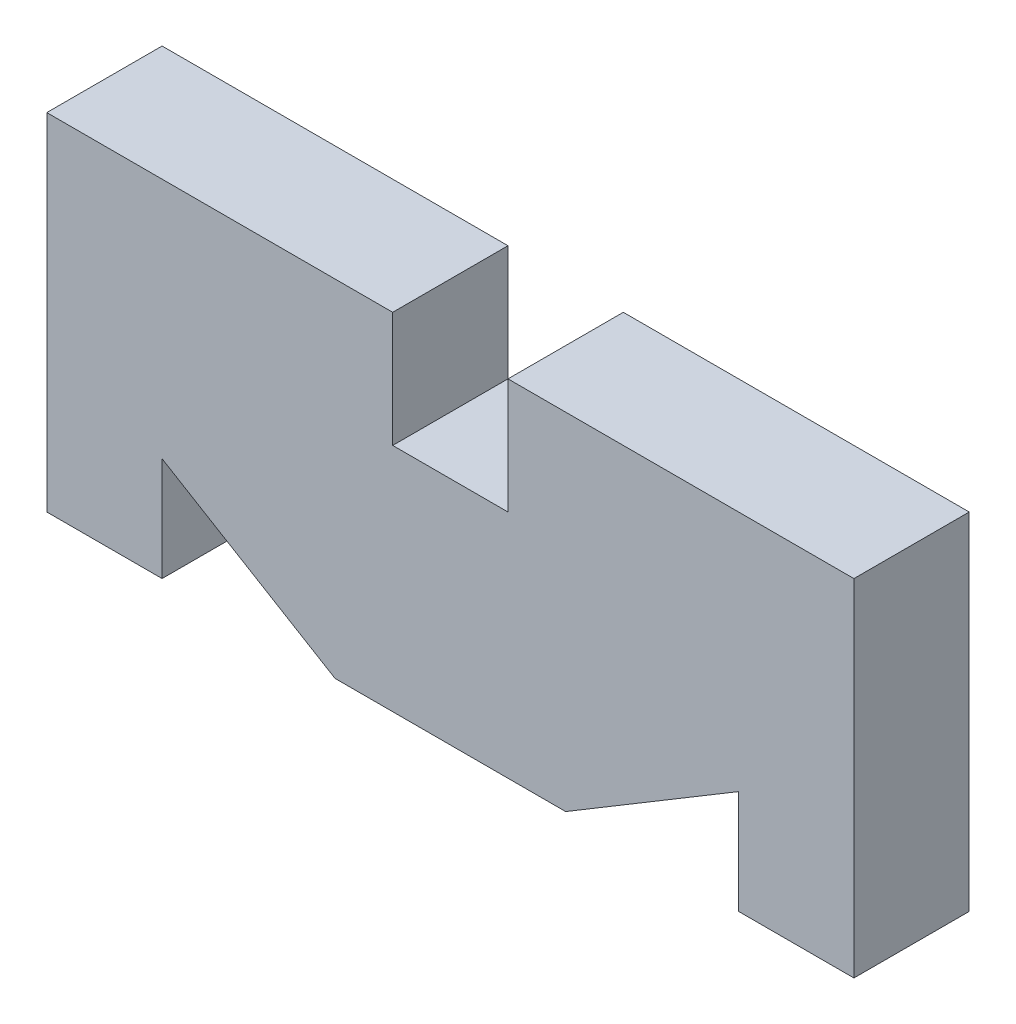
ISO-10303-21;
HEADER;
FILE_DESCRIPTION(('STEP AP214'),'2;1');
FILE_NAME('part.step','',(''),(''),'','','');
FILE_SCHEMA(('AUTOMOTIVE_DESIGN { 1 0 10303 214 1 1 1 1 }'));
ENDSEC;
DATA;
#1=APPLICATION_CONTEXT('core data for automotive mechanical design processes');
#2=APPLICATION_PROTOCOL_DEFINITION('international standard','automotive_design',2000,#1);
#3=PRODUCT_CONTEXT('',#1,'mechanical');
#4=PRODUCT('Part','Part','',(#3));
#5=PRODUCT_RELATED_PRODUCT_CATEGORY('part','',(#4));
#6=PRODUCT_DEFINITION_FORMATION('','',#4);
#7=PRODUCT_DEFINITION_CONTEXT('part definition',#1,'design');
#8=PRODUCT_DEFINITION('design','',#6,#7);
#9=PRODUCT_DEFINITION_SHAPE('','',#8);
#10=(LENGTH_UNIT() NAMED_UNIT(*) SI_UNIT(.MILLI.,.METRE.));
#11=(NAMED_UNIT(*) PLANE_ANGLE_UNIT() SI_UNIT($,.RADIAN.));
#12=(NAMED_UNIT(*) SI_UNIT($,.STERADIAN.) SOLID_ANGLE_UNIT());
#13=UNCERTAINTY_MEASURE_WITH_UNIT(LENGTH_MEASURE(1.E-05),#10,'distance_accuracy_value','');
#14=(GEOMETRIC_REPRESENTATION_CONTEXT(3) GLOBAL_UNCERTAINTY_ASSIGNED_CONTEXT((#13)) GLOBAL_UNIT_ASSIGNED_CONTEXT((#10,
#11,#12)) REPRESENTATION_CONTEXT('',''));
#15=CARTESIAN_POINT('',(0.,0.,0.));
#16=DIRECTION('',(0.,0.,1.));
#17=DIRECTION('',(1.,0.,0.));
#18=AXIS2_PLACEMENT_3D('',#15,#16,#17);
#19=CARTESIAN_POINT('',(7.02173913043446,22.9782608695652,10.));
#20=DIRECTION('',(0.,-1.,0.));
#21=DIRECTION('',(1.,0.,0.));
#22=AXIS2_PLACEMENT_3D('',#19,#20,#21);
#23=PLANE('',#22);
#24=DIRECTION('',(-1.,0.,0.));
#25=VECTOR('',#24,1.);
#26=CARTESIAN_POINT('',(7.02173913043446,22.9782608695652,0.));
#27=LINE('',#26,#25);
#28=CARTESIAN_POINT('',(7.02173913043446,22.9782608695652,0.));
#29=VERTEX_POINT('',#28);
#30=CARTESIAN_POINT('',(-22.9782608695655,22.9782608695652,0.));
#31=VERTEX_POINT('',#30);
#32=EDGE_CURVE('E165',#29,#31,#27,.T.);
#33=ORIENTED_EDGE('',*,*,#32,.T.);
#34=DIRECTION('',(0.,0.,-1.));
#35=VECTOR('',#34,1.);
#36=CARTESIAN_POINT('',(-22.9782608695655,22.9782608695652,10.));
#37=LINE('',#36,#35);
#38=CARTESIAN_POINT('',(-22.9782608695655,22.9782608695652,10.));
#39=VERTEX_POINT('',#38);
#40=EDGE_CURVE('E11',#39,#31,#37,.T.);
#41=ORIENTED_EDGE('',*,*,#40,.F.);
#42=DIRECTION('',(-1.,0.,0.));
#43=VECTOR('',#42,1.);
#44=CARTESIAN_POINT('',(7.02173913043446,22.9782608695652,10.));
#45=LINE('',#44,#43);
#46=CARTESIAN_POINT('',(7.02173913043446,22.9782608695652,10.));
#47=VERTEX_POINT('',#46);
#48=EDGE_CURVE('E191',#47,#39,#45,.T.);
#49=ORIENTED_EDGE('',*,*,#48,.F.);
#50=DIRECTION('',(0.,0.,-1.));
#51=VECTOR('',#50,1.);
#52=CARTESIAN_POINT('',(7.02173913043446,22.9782608695652,10.));
#53=LINE('',#52,#51);
#54=EDGE_CURVE('E161',#47,#29,#53,.T.);
#55=ORIENTED_EDGE('',*,*,#54,.T.);
#56=EDGE_LOOP('',(#33,#41,#49,#55));
#57=FACE_BOUND('',#56,.T.);
#58=ADVANCED_FACE('F33',(#57),#23,.F.);
#59=CARTESIAN_POINT('',(-22.9782608695655,22.9782608695652,10.));
#60=DIRECTION('',(1.,0.,0.));
#61=DIRECTION('',(0.,1.,0.));
#62=AXIS2_PLACEMENT_3D('',#59,#60,#61);
#63=PLANE('',#62);
#64=DIRECTION('',(0.,-1.,0.));
#65=VECTOR('',#64,1.);
#66=CARTESIAN_POINT('',(-22.9782608695655,22.9782608695652,0.));
#67=LINE('',#66,#65);
#68=CARTESIAN_POINT('',(-22.9782608695652,-7.02173913043478,0.));
#69=VERTEX_POINT('',#68);
#70=EDGE_CURVE('E168',#31,#69,#67,.T.);
#71=ORIENTED_EDGE('',*,*,#70,.T.);
#72=DIRECTION('',(0.,0.,-1.));
#73=VECTOR('',#72,1.);
#74=CARTESIAN_POINT('',(-22.9782608695652,-7.02173913043478,10.));
#75=LINE('',#74,#73);
#76=CARTESIAN_POINT('',(-22.9782608695652,-7.02173913043478,10.));
#77=VERTEX_POINT('',#76);
#78=EDGE_CURVE('E41',#77,#69,#75,.T.);
#79=ORIENTED_EDGE('',*,*,#78,.F.);
#80=DIRECTION('',(0.,-1.,0.));
#81=VECTOR('',#80,1.);
#82=CARTESIAN_POINT('',(-22.9782608695655,22.9782608695652,10.));
#83=LINE('',#82,#81);
#84=EDGE_CURVE('E110',#39,#77,#83,.T.);
#85=ORIENTED_EDGE('',*,*,#84,.F.);
#86=ORIENTED_EDGE('',*,*,#40,.T.);
#87=EDGE_LOOP('',(#71,#79,#85,#86));
#88=FACE_BOUND('',#87,.T.);
#89=ADVANCED_FACE('F279',(#88),#63,.F.);
#90=CARTESIAN_POINT('',(-22.9782608695652,-7.02173913043478,10.));
#91=DIRECTION('',(0.,1.,0.));
#92=DIRECTION('',(0.,0.,1.));
#93=AXIS2_PLACEMENT_3D('',#90,#91,#92);
#94=PLANE('',#93);
#95=DIRECTION('',(1.,0.,0.));
#96=VECTOR('',#95,1.);
#97=CARTESIAN_POINT('',(-22.9782608695652,-7.02173913043478,0.));
#98=LINE('',#97,#96);
#99=CARTESIAN_POINT('',(-12.9782608695652,-7.02173913043478,0.));
#100=VERTEX_POINT('',#99);
#101=EDGE_CURVE('E170',#69,#100,#98,.T.);
#102=ORIENTED_EDGE('',*,*,#101,.T.);
#103=DIRECTION('',(0.,0.,-1.));
#104=VECTOR('',#103,1.);
#105=CARTESIAN_POINT('',(-12.9782608695652,-7.02173913043478,10.));
#106=LINE('',#105,#104);
#107=CARTESIAN_POINT('',(-12.9782608695652,-7.02173913043478,10.));
#108=VERTEX_POINT('',#107);
#109=EDGE_CURVE('E216',#108,#100,#106,.T.);
#110=ORIENTED_EDGE('',*,*,#109,.F.);
#111=DIRECTION('',(1.,0.,0.));
#112=VECTOR('',#111,1.);
#113=CARTESIAN_POINT('',(-22.9782608695652,-7.02173913043478,10.));
#114=LINE('',#113,#112);
#115=EDGE_CURVE('E224',#77,#108,#114,.T.);
#116=ORIENTED_EDGE('',*,*,#115,.F.);
#117=ORIENTED_EDGE('',*,*,#78,.T.);
#118=EDGE_LOOP('',(#102,#110,#116,#117));
#119=FACE_BOUND('',#118,.T.);
#120=ADVANCED_FACE('F222',(#119),#94,.F.);
#121=CARTESIAN_POINT('',(-12.9782608695652,-7.02173913043478,10.));
#122=DIRECTION('',(-1.,0.,0.));
#123=DIRECTION('',(0.,0.,1.));
#124=AXIS2_PLACEMENT_3D('',#121,#122,#123);
#125=PLANE('',#124);
#126=DIRECTION('',(0.,1.,0.));
#127=VECTOR('',#126,1.);
#128=CARTESIAN_POINT('',(-12.9782608695652,-7.02173913043478,0.));
#129=LINE('',#128,#127);
#130=CARTESIAN_POINT('',(-12.9782608695652,1.97826086956522,0.));
#131=VERTEX_POINT('',#130);
#132=EDGE_CURVE('E172',#100,#131,#129,.T.);
#133=ORIENTED_EDGE('',*,*,#132,.T.);
#134=DIRECTION('',(0.,0.,-1.));
#135=VECTOR('',#134,1.);
#136=CARTESIAN_POINT('',(-12.9782608695652,1.97826086956522,10.));
#137=LINE('',#136,#135);
#138=CARTESIAN_POINT('',(-12.9782608695652,1.97826086956522,10.));
#139=VERTEX_POINT('',#138);
#140=EDGE_CURVE('E213',#139,#131,#137,.T.);
#141=ORIENTED_EDGE('',*,*,#140,.F.);
#142=DIRECTION('',(0.,1.,0.));
#143=VECTOR('',#142,1.);
#144=CARTESIAN_POINT('',(-12.9782608695652,-7.02173913043478,10.));
#145=LINE('',#144,#143);
#146=EDGE_CURVE('E242',#108,#139,#145,.T.);
#147=ORIENTED_EDGE('',*,*,#146,.F.);
#148=ORIENTED_EDGE('',*,*,#109,.T.);
#149=EDGE_LOOP('',(#133,#141,#147,#148));
#150=FACE_BOUND('',#149,.T.);
#151=ADVANCED_FACE('F233',(#150),#125,.F.);
#152=CARTESIAN_POINT('',(-12.9782608695652,1.97826086956522,10.));
#153=DIRECTION('',(0.514495755427513,0.857492925712552,0.));
#154=DIRECTION('',(-0.857492925712552,0.514495755427513,0.));
#155=AXIS2_PLACEMENT_3D('',#152,#153,#154);
#156=PLANE('',#155);
#157=DIRECTION('',(0.857492925712552,-0.514495755427513,0.));
#158=VECTOR('',#157,1.);
#159=CARTESIAN_POINT('',(-12.9782608695652,1.97826086956522,0.));
#160=LINE('',#159,#158);
#161=CARTESIAN_POINT('',(2.02173913043479,-7.02173913043446,0.));
#162=VERTEX_POINT('',#161);
#163=EDGE_CURVE('E174',#131,#162,#160,.T.);
#164=ORIENTED_EDGE('',*,*,#163,.T.);
#165=DIRECTION('',(0.,0.,-1.));
#166=VECTOR('',#165,1.);
#167=CARTESIAN_POINT('',(2.02173913043479,-7.02173913043446,10.));
#168=LINE('',#167,#166);
#169=CARTESIAN_POINT('',(2.02173913043479,-7.02173913043446,10.));
#170=VERTEX_POINT('',#169);
#171=EDGE_CURVE('E210',#170,#162,#168,.T.);
#172=ORIENTED_EDGE('',*,*,#171,.F.);
#173=DIRECTION('',(0.857492925712552,-0.514495755427513,0.));
#174=VECTOR('',#173,1.);
#175=CARTESIAN_POINT('',(-12.9782608695652,1.97826086956522,10.));
#176=LINE('',#175,#174);
#177=EDGE_CURVE('E239',#139,#170,#176,.T.);
#178=ORIENTED_EDGE('',*,*,#177,.F.);
#179=ORIENTED_EDGE('',*,*,#140,.T.);
#180=EDGE_LOOP('',(#164,#172,#178,#179));
#181=FACE_BOUND('',#180,.T.);
#182=ADVANCED_FACE('F237',(#181),#156,.F.);
#183=CARTESIAN_POINT('',(2.02173913043479,-7.02173913043446,10.));
#184=DIRECTION('',(0.,1.,0.));
#185=DIRECTION('',(-1.,0.,0.));
#186=AXIS2_PLACEMENT_3D('',#183,#184,#185);
#187=PLANE('',#186);
#188=DIRECTION('',(1.,0.,0.));
#189=VECTOR('',#188,1.);
#190=CARTESIAN_POINT('',(2.02173913043479,-7.02173913043446,0.));
#191=LINE('',#190,#189);
#192=CARTESIAN_POINT('',(22.0217391304348,-7.02173913043446,0.));
#193=VERTEX_POINT('',#192);
#194=EDGE_CURVE('E176',#162,#193,#191,.T.);
#195=ORIENTED_EDGE('',*,*,#194,.T.);
#196=DIRECTION('',(0.,0.,-1.));
#197=VECTOR('',#196,1.);
#198=CARTESIAN_POINT('',(22.0217391304348,-7.02173913043446,10.));
#199=LINE('',#198,#197);
#200=CARTESIAN_POINT('',(22.0217391304348,-7.02173913043446,10.));
#201=VERTEX_POINT('',#200);
#202=EDGE_CURVE('E207',#201,#193,#199,.T.);
#203=ORIENTED_EDGE('',*,*,#202,.F.);
#204=DIRECTION('',(1.,0.,0.));
#205=VECTOR('',#204,1.);
#206=CARTESIAN_POINT('',(2.02173913043479,-7.02173913043446,10.));
#207=LINE('',#206,#205);
#208=EDGE_CURVE('E241',#170,#201,#207,.T.);
#209=ORIENTED_EDGE('',*,*,#208,.F.);
#210=ORIENTED_EDGE('',*,*,#171,.T.);
#211=EDGE_LOOP('',(#195,#203,#209,#210));
#212=FACE_BOUND('',#211,.T.);
#213=ADVANCED_FACE('F292',(#212),#187,.F.);
#214=CARTESIAN_POINT('',(37.0217391304348,1.97826086956523,10.));
#215=DIRECTION('',(-0.514495755427514,0.857492925712552,0.));
#216=DIRECTION('',(-0.857492925712552,-0.514495755427514,0.));
#217=AXIS2_PLACEMENT_3D('',#214,#215,#216);
#218=PLANE('',#217);
#219=DIRECTION('',(0.857492925712552,0.514495755427514,0.));
#220=VECTOR('',#219,1.);
#221=CARTESIAN_POINT('',(37.0217391304348,1.97826086956523,0.));
#222=LINE('',#221,#220);
#223=CARTESIAN_POINT('',(37.0217391304348,1.97826086956523,0.));
#224=VERTEX_POINT('',#223);
#225=EDGE_CURVE('E178',#193,#224,#222,.T.);
#226=ORIENTED_EDGE('',*,*,#225,.T.);
#227=DIRECTION('',(0.,0.,-1.));
#228=VECTOR('',#227,1.);
#229=CARTESIAN_POINT('',(37.0217391304348,1.97826086956523,10.));
#230=LINE('',#229,#228);
#231=CARTESIAN_POINT('',(37.0217391304348,1.97826086956523,10.));
#232=VERTEX_POINT('',#231);
#233=EDGE_CURVE('E204',#232,#224,#230,.T.);
#234=ORIENTED_EDGE('',*,*,#233,.F.);
#235=DIRECTION('',(0.857492925712552,0.514495755427514,0.));
#236=VECTOR('',#235,1.);
#237=CARTESIAN_POINT('',(37.0217391304348,1.97826086956523,10.));
#238=LINE('',#237,#236);
#239=EDGE_CURVE('E244',#201,#232,#238,.T.);
#240=ORIENTED_EDGE('',*,*,#239,.F.);
#241=ORIENTED_EDGE('',*,*,#202,.T.);
#242=EDGE_LOOP('',(#226,#234,#240,#241));
#243=FACE_BOUND('',#242,.T.);
#244=ADVANCED_FACE('F295',(#243),#218,.F.);
#245=CARTESIAN_POINT('',(37.0217391304348,-7.02173913043477,10.));
#246=DIRECTION('',(1.,0.,0.));
#247=DIRECTION('',(0.,0.,-1.));
#248=AXIS2_PLACEMENT_3D('',#245,#246,#247);
#249=PLANE('',#248);
#250=DIRECTION('',(0.,-1.,0.));
#251=VECTOR('',#250,1.);
#252=CARTESIAN_POINT('',(37.0217391304348,-7.02173913043477,0.));
#253=LINE('',#252,#251);
#254=CARTESIAN_POINT('',(37.0217391304348,-7.02173913043477,0.));
#255=VERTEX_POINT('',#254);
#256=EDGE_CURVE('E180',#224,#255,#253,.T.);
#257=ORIENTED_EDGE('',*,*,#256,.T.);
#258=DIRECTION('',(0.,0.,-1.));
#259=VECTOR('',#258,1.);
#260=CARTESIAN_POINT('',(37.0217391304348,-7.02173913043477,10.));
#261=LINE('',#260,#259);
#262=CARTESIAN_POINT('',(37.0217391304348,-7.02173913043477,10.));
#263=VERTEX_POINT('',#262);
#264=EDGE_CURVE('E201',#263,#255,#261,.T.);
#265=ORIENTED_EDGE('',*,*,#264,.F.);
#266=DIRECTION('',(0.,-1.,0.));
#267=VECTOR('',#266,1.);
#268=CARTESIAN_POINT('',(37.0217391304348,-7.02173913043477,10.));
#269=LINE('',#268,#267);
#270=EDGE_CURVE('E250',#232,#263,#269,.T.);
#271=ORIENTED_EDGE('',*,*,#270,.F.);
#272=ORIENTED_EDGE('',*,*,#233,.T.);
#273=EDGE_LOOP('',(#257,#265,#271,#272));
#274=FACE_BOUND('',#273,.T.);
#275=ADVANCED_FACE('F299',(#274),#249,.F.);
#276=CARTESIAN_POINT('',(47.0217391304348,-7.02173913043477,10.));
#277=DIRECTION('',(0.,1.,0.));
#278=DIRECTION('',(-1.,0.,0.));
#279=AXIS2_PLACEMENT_3D('',#276,#277,#278);
#280=PLANE('',#279);
#281=DIRECTION('',(1.,0.,0.));
#282=VECTOR('',#281,1.);
#283=CARTESIAN_POINT('',(47.0217391304348,-7.02173913043477,0.));
#284=LINE('',#283,#282);
#285=CARTESIAN_POINT('',(47.0217391304348,-7.02173913043477,0.));
#286=VERTEX_POINT('',#285);
#287=EDGE_CURVE('E182',#255,#286,#284,.T.);
#288=ORIENTED_EDGE('',*,*,#287,.T.);
#289=DIRECTION('',(0.,0.,-1.));
#290=VECTOR('',#289,1.);
#291=CARTESIAN_POINT('',(47.0217391304348,-7.02173913043477,10.));
#292=LINE('',#291,#290);
#293=CARTESIAN_POINT('',(47.0217391304348,-7.02173913043477,10.));
#294=VERTEX_POINT('',#293);
#295=EDGE_CURVE('E198',#294,#286,#292,.T.);
#296=ORIENTED_EDGE('',*,*,#295,.F.);
#297=DIRECTION('',(1.,0.,0.));
#298=VECTOR('',#297,1.);
#299=CARTESIAN_POINT('',(47.0217391304348,-7.02173913043477,10.));
#300=LINE('',#299,#298);
#301=EDGE_CURVE('E252',#263,#294,#300,.T.);
#302=ORIENTED_EDGE('',*,*,#301,.F.);
#303=ORIENTED_EDGE('',*,*,#264,.T.);
#304=EDGE_LOOP('',(#288,#296,#302,#303));
#305=FACE_BOUND('',#304,.T.);
#306=ADVANCED_FACE('F303',(#305),#280,.F.);
#307=CARTESIAN_POINT('',(47.0217391304351,22.9782608695652,10.));
#308=DIRECTION('',(-1.,0.,0.));
#309=DIRECTION('',(0.,-1.,0.));
#310=AXIS2_PLACEMENT_3D('',#307,#308,#309);
#311=PLANE('',#310);
#312=DIRECTION('',(0.,1.,0.));
#313=VECTOR('',#312,1.);
#314=CARTESIAN_POINT('',(47.0217391304351,22.9782608695652,0.));
#315=LINE('',#314,#313);
#316=CARTESIAN_POINT('',(47.0217391304351,22.9782608695652,0.));
#317=VERTEX_POINT('',#316);
#318=EDGE_CURVE('E184',#286,#317,#315,.T.);
#319=ORIENTED_EDGE('',*,*,#318,.T.);
#320=DIRECTION('',(0.,0.,-1.));
#321=VECTOR('',#320,1.);
#322=CARTESIAN_POINT('',(47.0217391304351,22.9782608695652,10.));
#323=LINE('',#322,#321);
#324=CARTESIAN_POINT('',(47.0217391304351,22.9782608695652,10.));
#325=VERTEX_POINT('',#324);
#326=EDGE_CURVE('E195',#325,#317,#323,.T.);
#327=ORIENTED_EDGE('',*,*,#326,.F.);
#328=DIRECTION('',(0.,1.,0.));
#329=VECTOR('',#328,1.);
#330=CARTESIAN_POINT('',(47.0217391304351,22.9782608695652,10.));
#331=LINE('',#330,#329);
#332=EDGE_CURVE('E254',#294,#325,#331,.T.);
#333=ORIENTED_EDGE('',*,*,#332,.F.);
#334=ORIENTED_EDGE('',*,*,#295,.T.);
#335=EDGE_LOOP('',(#319,#327,#333,#334));
#336=FACE_BOUND('',#335,.T.);
#337=ADVANCED_FACE('F260',(#336),#311,.F.);
#338=CARTESIAN_POINT('',(17.0217391304351,22.9782608695652,10.));
#339=DIRECTION('',(0.,-1.,0.));
#340=DIRECTION('',(1.,0.,0.));
#341=AXIS2_PLACEMENT_3D('',#338,#339,#340);
#342=PLANE('',#341);
#343=DIRECTION('',(-1.,0.,0.));
#344=VECTOR('',#343,1.);
#345=CARTESIAN_POINT('',(17.0217391304351,22.9782608695652,0.));
#346=LINE('',#345,#344);
#347=CARTESIAN_POINT('',(17.0217391304351,22.9782608695652,0.));
#348=VERTEX_POINT('',#347);
#349=EDGE_CURVE('E186',#317,#348,#346,.T.);
#350=ORIENTED_EDGE('',*,*,#349,.T.);
#351=DIRECTION('',(0.,0.,-1.));
#352=VECTOR('',#351,1.);
#353=CARTESIAN_POINT('',(17.0217391304351,22.9782608695652,10.));
#354=LINE('',#353,#352);
#355=CARTESIAN_POINT('',(17.0217391304351,22.9782608695652,10.));
#356=VERTEX_POINT('',#355);
#357=EDGE_CURVE('E156',#356,#348,#354,.T.);
#358=ORIENTED_EDGE('',*,*,#357,.F.);
#359=DIRECTION('',(-1.,0.,0.));
#360=VECTOR('',#359,1.);
#361=CARTESIAN_POINT('',(17.0217391304351,22.9782608695652,10.));
#362=LINE('',#361,#360);
#363=EDGE_CURVE('E147',#325,#356,#362,.T.);
#364=ORIENTED_EDGE('',*,*,#363,.F.);
#365=ORIENTED_EDGE('',*,*,#326,.T.);
#366=EDGE_LOOP('',(#350,#358,#364,#365));
#367=FACE_BOUND('',#366,.T.);
#368=ADVANCED_FACE('F264',(#367),#342,.F.);
#369=CARTESIAN_POINT('',(17.0217391304351,12.9782608695652,10.));
#370=DIRECTION('',(1.,0.,0.));
#371=DIRECTION('',(0.,0.,-1.));
#372=AXIS2_PLACEMENT_3D('',#369,#370,#371);
#373=PLANE('',#372);
#374=DIRECTION('',(0.,-1.,0.));
#375=VECTOR('',#374,1.);
#376=CARTESIAN_POINT('',(17.0217391304351,12.9782608695652,0.));
#377=LINE('',#376,#375);
#378=CARTESIAN_POINT('',(17.0217391304351,12.9782608695652,0.));
#379=VERTEX_POINT('',#378);
#380=EDGE_CURVE('E155',#348,#379,#377,.T.);
#381=ORIENTED_EDGE('',*,*,#380,.T.);
#382=DIRECTION('',(0.,0.,-1.));
#383=VECTOR('',#382,1.);
#384=CARTESIAN_POINT('',(17.0217391304351,12.9782608695652,10.));
#385=LINE('',#384,#383);
#386=CARTESIAN_POINT('',(17.0217391304351,12.9782608695652,10.));
#387=VERTEX_POINT('',#386);
#388=EDGE_CURVE('E152',#387,#379,#385,.T.);
#389=ORIENTED_EDGE('',*,*,#388,.F.);
#390=DIRECTION('',(0.,-1.,0.));
#391=VECTOR('',#390,1.);
#392=CARTESIAN_POINT('',(17.0217391304351,12.9782608695652,10.));
#393=LINE('',#392,#391);
#394=EDGE_CURVE('E141',#356,#387,#393,.T.);
#395=ORIENTED_EDGE('',*,*,#394,.F.);
#396=ORIENTED_EDGE('',*,*,#357,.T.);
#397=EDGE_LOOP('',(#381,#389,#395,#396));
#398=FACE_BOUND('',#397,.T.);
#399=ADVANCED_FACE('F153',(#398),#373,.F.);
#400=CARTESIAN_POINT('',(17.0217391304351,12.9782608695652,10.));
#401=DIRECTION('',(0.,-1.,0.));
#402=DIRECTION('',(0.,0.,-1.));
#403=AXIS2_PLACEMENT_3D('',#400,#401,#402);
#404=PLANE('',#403);
#405=DIRECTION('',(-1.,0.,0.));
#406=VECTOR('',#405,1.);
#407=CARTESIAN_POINT('',(17.0217391304351,12.9782608695652,0.));
#408=LINE('',#407,#406);
#409=CARTESIAN_POINT('',(7.02173913043446,12.9782608695652,0.));
#410=VERTEX_POINT('',#409);
#411=EDGE_CURVE('E96',#379,#410,#408,.T.);
#412=ORIENTED_EDGE('',*,*,#411,.T.);
#413=DIRECTION('',(0.,0.,-1.));
#414=VECTOR('',#413,1.);
#415=CARTESIAN_POINT('',(7.02173913043446,12.9782608695652,10.));
#416=LINE('',#415,#414);
#417=CARTESIAN_POINT('',(7.02173913043446,12.9782608695652,10.));
#418=VERTEX_POINT('',#417);
#419=EDGE_CURVE('E157',#418,#410,#416,.T.);
#420=ORIENTED_EDGE('',*,*,#419,.F.);
#421=DIRECTION('',(-1.,0.,0.));
#422=VECTOR('',#421,1.);
#423=CARTESIAN_POINT('',(17.0217391304351,12.9782608695652,10.));
#424=LINE('',#423,#422);
#425=EDGE_CURVE('E145',#387,#418,#424,.T.);
#426=ORIENTED_EDGE('',*,*,#425,.F.);
#427=ORIENTED_EDGE('',*,*,#388,.T.);
#428=EDGE_LOOP('',(#412,#420,#426,#427));
#429=FACE_BOUND('',#428,.T.);
#430=ADVANCED_FACE('F159',(#429),#404,.F.);
#431=CARTESIAN_POINT('',(7.02173913043446,12.9782608695652,10.));
#432=DIRECTION('',(-1.,0.,0.));
#433=DIRECTION('',(0.,-1.,0.));
#434=AXIS2_PLACEMENT_3D('',#431,#432,#433);
#435=PLANE('',#434);
#436=DIRECTION('',(0.,1.,0.));
#437=VECTOR('',#436,1.);
#438=CARTESIAN_POINT('',(7.02173913043446,12.9782608695652,0.));
#439=LINE('',#438,#437);
#440=EDGE_CURVE('E102',#410,#29,#439,.T.);
#441=ORIENTED_EDGE('',*,*,#440,.T.);
#442=ORIENTED_EDGE('',*,*,#54,.F.);
#443=DIRECTION('',(0.,1.,0.));
#444=VECTOR('',#443,1.);
#445=CARTESIAN_POINT('',(7.02173913043446,12.9782608695652,10.));
#446=LINE('',#445,#444);
#447=EDGE_CURVE('E49',#418,#47,#446,.T.);
#448=ORIENTED_EDGE('',*,*,#447,.F.);
#449=ORIENTED_EDGE('',*,*,#419,.T.);
#450=EDGE_LOOP('',(#441,#442,#448,#449));
#451=FACE_BOUND('',#450,.T.);
#452=ADVANCED_FACE('F268',(#451),#435,.F.);
#453=CARTESIAN_POINT('',(0.,0.,10.));
#454=DIRECTION('',(0.,0.,1.));
#455=DIRECTION('',(1.,0.,0.));
#456=AXIS2_PLACEMENT_3D('',#453,#454,#455);
#457=PLANE('',#456);
#458=ORIENTED_EDGE('',*,*,#48,.T.);
#459=ORIENTED_EDGE('',*,*,#84,.T.);
#460=ORIENTED_EDGE('',*,*,#115,.T.);
#461=ORIENTED_EDGE('',*,*,#146,.T.);
#462=ORIENTED_EDGE('',*,*,#177,.T.);
#463=ORIENTED_EDGE('',*,*,#208,.T.);
#464=ORIENTED_EDGE('',*,*,#239,.T.);
#465=ORIENTED_EDGE('',*,*,#270,.T.);
#466=ORIENTED_EDGE('',*,*,#301,.T.);
#467=ORIENTED_EDGE('',*,*,#332,.T.);
#468=ORIENTED_EDGE('',*,*,#363,.T.);
#469=ORIENTED_EDGE('',*,*,#394,.T.);
#470=ORIENTED_EDGE('',*,*,#425,.T.);
#471=ORIENTED_EDGE('',*,*,#447,.T.);
#472=EDGE_LOOP('',(#458,#459,#460,#461,#462,#463,#464,#465,#466,#467,#468,#469,#470,#471));
#473=FACE_BOUND('',#472,.T.);
#474=ADVANCED_FACE('F143',(#473),#457,.T.);
#475=CARTESIAN_POINT('',(0.,0.,0.));
#476=DIRECTION('',(0.,0.,1.));
#477=DIRECTION('',(1.,0.,0.));
#478=AXIS2_PLACEMENT_3D('',#475,#476,#477);
#479=PLANE('',#478);
#480=ORIENTED_EDGE('',*,*,#32,.F.);
#481=ORIENTED_EDGE('',*,*,#440,.F.);
#482=ORIENTED_EDGE('',*,*,#411,.F.);
#483=ORIENTED_EDGE('',*,*,#380,.F.);
#484=ORIENTED_EDGE('',*,*,#349,.F.);
#485=ORIENTED_EDGE('',*,*,#318,.F.);
#486=ORIENTED_EDGE('',*,*,#287,.F.);
#487=ORIENTED_EDGE('',*,*,#256,.F.);
#488=ORIENTED_EDGE('',*,*,#225,.F.);
#489=ORIENTED_EDGE('',*,*,#194,.F.);
#490=ORIENTED_EDGE('',*,*,#163,.F.);
#491=ORIENTED_EDGE('',*,*,#132,.F.);
#492=ORIENTED_EDGE('',*,*,#101,.F.);
#493=ORIENTED_EDGE('',*,*,#70,.F.);
#494=EDGE_LOOP('',(#480,#481,#482,#483,#484,#485,#486,#487,#488,#489,#490,#491,#492,#493));
#495=FACE_BOUND('',#494,.T.);
#496=ADVANCED_FACE('F228',(#495),#479,.F.);
#497=CLOSED_SHELL('',(#58,#89,#120,#151,#182,#213,#244,#275,#306,#337,#368,#399,#430,#452,#474,#496));
#498=MANIFOLD_SOLID_BREP('B2',#497);
#499=ADVANCED_BREP_SHAPE_REPRESENTATION('',(#18,#498),#14);
#500=SHAPE_DEFINITION_REPRESENTATION(#9,#499);
ENDSEC;
END-ISO-10303-21;
